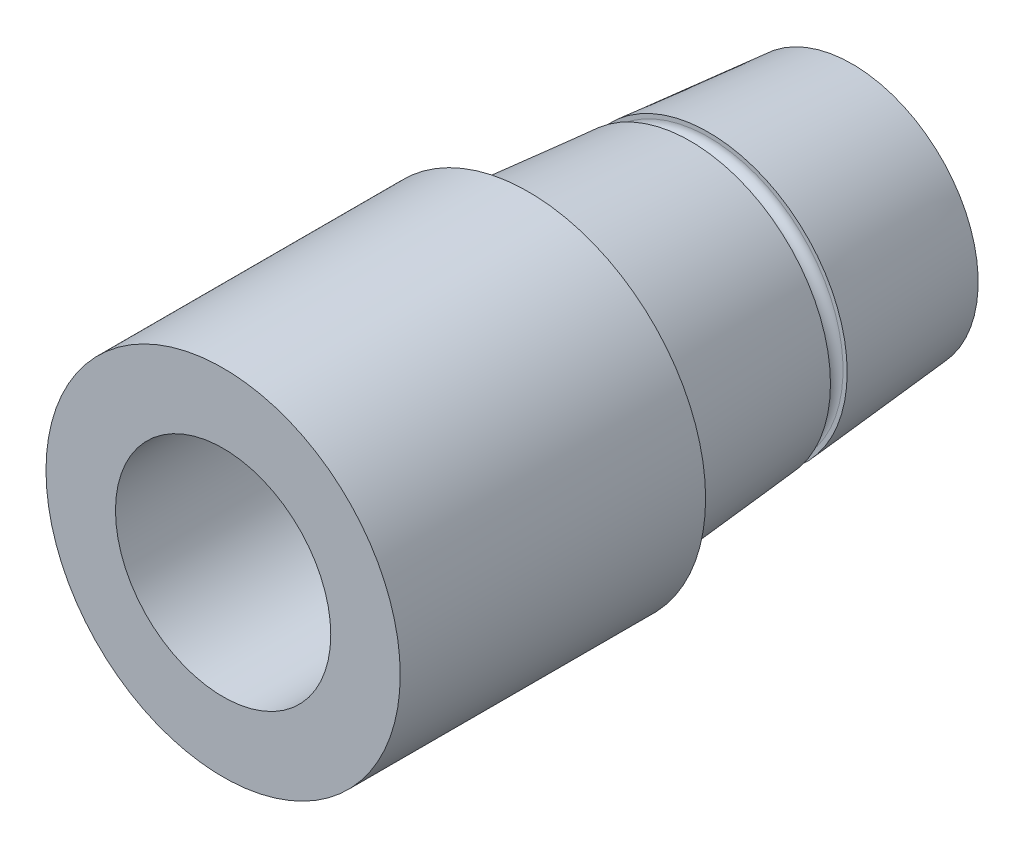
ISO-10303-21;
HEADER;
FILE_DESCRIPTION(('STEP AP214'),'2;1');
FILE_NAME('part.step','',(''),(''),'','','');
FILE_SCHEMA(('AUTOMOTIVE_DESIGN { 1 0 10303 214 1 1 1 1 }'));
ENDSEC;
DATA;
#1=APPLICATION_CONTEXT('core data for automotive mechanical design processes');
#2=APPLICATION_PROTOCOL_DEFINITION('international standard','automotive_design',2000,#1);
#3=PRODUCT_CONTEXT('',#1,'mechanical');
#4=PRODUCT('Part','Part','',(#3));
#5=PRODUCT_RELATED_PRODUCT_CATEGORY('part','',(#4));
#6=PRODUCT_DEFINITION_FORMATION('','',#4);
#7=PRODUCT_DEFINITION_CONTEXT('part definition',#1,'design');
#8=PRODUCT_DEFINITION('design','',#6,#7);
#9=PRODUCT_DEFINITION_SHAPE('','',#8);
#10=(LENGTH_UNIT() NAMED_UNIT(*) SI_UNIT(.MILLI.,.METRE.));
#11=(NAMED_UNIT(*) PLANE_ANGLE_UNIT() SI_UNIT($,.RADIAN.));
#12=(NAMED_UNIT(*) SI_UNIT($,.STERADIAN.) SOLID_ANGLE_UNIT());
#13=UNCERTAINTY_MEASURE_WITH_UNIT(LENGTH_MEASURE(1.E-05),#10,'distance_accuracy_value','');
#14=(GEOMETRIC_REPRESENTATION_CONTEXT(3) GLOBAL_UNCERTAINTY_ASSIGNED_CONTEXT((#13)) GLOBAL_UNIT_ASSIGNED_CONTEXT((#10,
#11,#12)) REPRESENTATION_CONTEXT('',''));
#15=CARTESIAN_POINT('',(0.,0.,0.));
#16=DIRECTION('',(0.,0.,1.));
#17=DIRECTION('',(1.,0.,0.));
#18=AXIS2_PLACEMENT_3D('',#15,#16,#17);
#19=CARTESIAN_POINT('',(0.,0.,-50.));
#20=DIRECTION('',(0.,0.,1.));
#21=DIRECTION('',(-1.,0.,0.));
#22=AXIS2_PLACEMENT_3D('',#19,#20,#21);
#23=CONICAL_SURFACE('',#22,20.6255668237038,0.0872664625997167);
#24=CARTESIAN_POINT('',(0.,0.,-26.5));
#25=DIRECTION('',(0.,0.,-1.));
#26=DIRECTION('',(-1.,0.,0.));
#27=AXIS2_PLACEMENT_3D('',#24,#25,#26);
#28=CIRCLE('',#27,22.681550416563);
#29=CARTESIAN_POINT('',(-22.681550416563,0.,-26.5));
#30=VERTEX_POINT('',#29);
#31=EDGE_CURVE('E35',#30,#30,#28,.F.);
#32=ORIENTED_EDGE('',*,*,#31,.F.);
#33=EDGE_LOOP('',(#32));
#34=FACE_BOUND('',#33,.T.);
#35=CARTESIAN_POINT('',(0.,0.,-50.));
#36=DIRECTION('',(0.,0.,-1.));
#37=DIRECTION('',(-1.,0.,0.));
#38=AXIS2_PLACEMENT_3D('',#35,#36,#37);
#39=CIRCLE('',#38,20.6255668237038);
#40=CARTESIAN_POINT('',(-20.6255668237038,0.,-50.));
#41=VERTEX_POINT('',#40);
#42=EDGE_CURVE('E10',#41,#41,#39,.T.);
#43=ORIENTED_EDGE('',*,*,#42,.F.);
#44=EDGE_LOOP('',(#43));
#45=FACE_BOUND('',#44,.T.);
#46=ADVANCED_FACE('F31',(#34,#45),#23,.T.);
#47=CARTESIAN_POINT('',(0.,0.,-23.5));
#48=DIRECTION('',(0.,0.,1.));
#49=DIRECTION('',(1.,0.,0.));
#50=AXIS2_PLACEMENT_3D('',#47,#48,#49);
#51=CIRCLE('',#50,22.9440164071408);
#52=CARTESIAN_POINT('',(22.9440164071408,0.,-23.5));
#53=VERTEX_POINT('',#52);
#54=EDGE_CURVE('E51',#53,#53,#51,.F.);
#55=ORIENTED_EDGE('',*,*,#54,.F.);
#56=EDGE_LOOP('',(#55));
#57=FACE_BOUND('',#56,.T.);
#58=CARTESIAN_POINT('',(0.,0.,3.));
#59=DIRECTION('',(0.,0.,-1.));
#60=DIRECTION('',(-1.,0.,0.));
#61=AXIS2_PLACEMENT_3D('',#58,#59,#60);
#62=CIRCLE('',#61,25.2624659905778);
#63=CARTESIAN_POINT('',(-25.2624659905778,0.,3.));
#64=VERTEX_POINT('',#63);
#65=EDGE_CURVE('E47',#64,#64,#62,.T.);
#66=ORIENTED_EDGE('',*,*,#65,.T.);
#67=EDGE_LOOP('',(#66));
#68=FACE_BOUND('',#67,.T.);
#69=ADVANCED_FACE('F33',(#57,#68),#23,.T.);
#70=CARTESIAN_POINT('',(0.,0.,-50.));
#71=DIRECTION('',(0.,0.,-1.));
#72=DIRECTION('',(-1.,0.,0.));
#73=AXIS2_PLACEMENT_3D('',#70,#71,#72);
#74=PLANE('',#73);
#75=CARTESIAN_POINT('',(0.,0.,-50.));
#76=DIRECTION('',(0.,0.,-1.));
#77=DIRECTION('',(-1.,0.,0.));
#78=AXIS2_PLACEMENT_3D('',#75,#76,#77);
#79=CIRCLE('',#78,17.6255668237038);
#80=CARTESIAN_POINT('',(-17.6255668237038,0.,-50.));
#81=VERTEX_POINT('',#80);
#82=EDGE_CURVE('E39',#81,#81,#79,.T.);
#83=ORIENTED_EDGE('',*,*,#82,.F.);
#84=EDGE_LOOP('',(#83));
#85=FACE_BOUND('',#84,.T.);
#86=ORIENTED_EDGE('',*,*,#42,.T.);
#87=EDGE_LOOP('',(#86));
#88=FACE_BOUND('',#87,.T.);
#89=ADVANCED_FACE('F94',(#85,#88),#74,.T.);
#90=CARTESIAN_POINT('',(0.,0.,3.));
#91=DIRECTION('',(0.,0.,-1.));
#92=DIRECTION('',(-1.,0.,0.));
#93=AXIS2_PLACEMENT_3D('',#90,#91,#92);
#94=CYLINDRICAL_SURFACE('',#93,17.6255668237038);
#95=ORIENTED_EDGE('',*,*,#82,.T.);
#96=EDGE_LOOP('',(#95));
#97=FACE_BOUND('',#96,.T.);
#98=CARTESIAN_POINT('',(0.,0.,53.));
#99=DIRECTION('',(0.,0.,1.));
#100=DIRECTION('',(1.,0.,0.));
#101=AXIS2_PLACEMENT_3D('',#98,#99,#100);
#102=CIRCLE('',#101,17.6255668237038);
#103=CARTESIAN_POINT('',(17.6255668237038,0.,53.));
#104=VERTEX_POINT('',#103);
#105=EDGE_CURVE('E66',#104,#104,#102,.T.);
#106=ORIENTED_EDGE('',*,*,#105,.T.);
#107=EDGE_LOOP('',(#106));
#108=FACE_BOUND('',#107,.T.);
#109=ADVANCED_FACE('F72',(#97,#108),#94,.F.);
#110=CARTESIAN_POINT('',(0.,0.,-25.));
#111=DIRECTION('',(0.,0.,-1.));
#112=DIRECTION('',(-1.,0.,0.));
#113=AXIS2_PLACEMENT_3D('',#110,#111,#112);
#114=TOROIDAL_SURFACE('',#113,22.,1.5);
#115=CARTESIAN_POINT('',(0.,0.,-26.5));
#116=DIRECTION('',(0.,0.,-1.));
#117=DIRECTION('',(-1.,0.,0.));
#118=AXIS2_PLACEMENT_3D('',#115,#116,#117);
#119=CIRCLE('',#118,22.);
#120=CARTESIAN_POINT('',(-22.,0.,-26.5));
#121=VERTEX_POINT('',#120);
#122=EDGE_CURVE('E53',#121,#121,#119,.T.);
#123=ORIENTED_EDGE('',*,*,#122,.F.);
#124=EDGE_LOOP('',(#123));
#125=FACE_BOUND('',#124,.T.);
#126=CARTESIAN_POINT('',(0.,0.,-23.5));
#127=DIRECTION('',(0.,0.,-1.));
#128=DIRECTION('',(-1.,0.,0.));
#129=AXIS2_PLACEMENT_3D('',#126,#127,#128);
#130=CIRCLE('',#129,22.);
#131=CARTESIAN_POINT('',(-22.,0.,-23.5));
#132=VERTEX_POINT('',#131);
#133=EDGE_CURVE('E49',#132,#132,#130,.T.);
#134=ORIENTED_EDGE('',*,*,#133,.T.);
#135=EDGE_LOOP('',(#134));
#136=FACE_BOUND('',#135,.T.);
#137=ADVANCED_FACE('F100',(#125,#136),#114,.F.);
#138=CARTESIAN_POINT('',(0.,22.,-26.5));
#139=DIRECTION('',(0.,0.,-1.));
#140=DIRECTION('',(-1.,0.,0.));
#141=AXIS2_PLACEMENT_3D('',#138,#139,#140);
#142=PLANE('',#141);
#143=ORIENTED_EDGE('',*,*,#31,.T.);
#144=EDGE_LOOP('',(#143));
#145=FACE_BOUND('',#144,.T.);
#146=ORIENTED_EDGE('',*,*,#122,.T.);
#147=EDGE_LOOP('',(#146));
#148=FACE_BOUND('',#147,.T.);
#149=ADVANCED_FACE('F87',(#145,#148),#142,.F.);
#150=CARTESIAN_POINT('',(0.,23.5,-23.5));
#151=DIRECTION('',(0.,0.,1.));
#152=DIRECTION('',(1.,0.,0.));
#153=AXIS2_PLACEMENT_3D('',#150,#151,#152);
#154=PLANE('',#153);
#155=ORIENTED_EDGE('',*,*,#54,.T.);
#156=EDGE_LOOP('',(#155));
#157=FACE_BOUND('',#156,.T.);
#158=ORIENTED_EDGE('',*,*,#133,.F.);
#159=EDGE_LOOP('',(#158));
#160=FACE_BOUND('',#159,.T.);
#161=ADVANCED_FACE('F77',(#157,#160),#154,.F.);
#162=CARTESIAN_POINT('',(0.,0.,53.));
#163=DIRECTION('',(0.,0.,1.));
#164=DIRECTION('',(1.,0.,0.));
#165=AXIS2_PLACEMENT_3D('',#162,#163,#164);
#166=PLANE('',#165);
#167=CARTESIAN_POINT('',(0.,0.,53.));
#168=DIRECTION('',(0.,0.,1.));
#169=DIRECTION('',(1.,0.,0.));
#170=AXIS2_PLACEMENT_3D('',#167,#168,#169);
#171=CIRCLE('',#170,29.);
#172=CARTESIAN_POINT('',(29.,0.,53.));
#173=VERTEX_POINT('',#172);
#174=EDGE_CURVE('E50',#173,#173,#171,.T.);
#175=ORIENTED_EDGE('',*,*,#174,.T.);
#176=EDGE_LOOP('',(#175));
#177=FACE_BOUND('',#176,.T.);
#178=ORIENTED_EDGE('',*,*,#105,.F.);
#179=EDGE_LOOP('',(#178));
#180=FACE_BOUND('',#179,.T.);
#181=ADVANCED_FACE('F74',(#177,#180),#166,.T.);
#182=CARTESIAN_POINT('',(0.,0.,3.));
#183=DIRECTION('',(0.,0.,1.));
#184=DIRECTION('',(1.,0.,0.));
#185=AXIS2_PLACEMENT_3D('',#182,#183,#184);
#186=PLANE('',#185);
#187=ORIENTED_EDGE('',*,*,#65,.F.);
#188=EDGE_LOOP('',(#187));
#189=FACE_BOUND('',#188,.T.);
#190=CARTESIAN_POINT('',(0.,0.,3.));
#191=DIRECTION('',(0.,0.,1.));
#192=DIRECTION('',(1.,0.,0.));
#193=AXIS2_PLACEMENT_3D('',#190,#191,#192);
#194=CIRCLE('',#193,29.);
#195=CARTESIAN_POINT('',(29.,0.,3.));
#196=VERTEX_POINT('',#195);
#197=EDGE_CURVE('E63',#196,#196,#194,.T.);
#198=ORIENTED_EDGE('',*,*,#197,.F.);
#199=EDGE_LOOP('',(#198));
#200=FACE_BOUND('',#199,.T.);
#201=ADVANCED_FACE('F76',(#189,#200),#186,.F.);
#202=CARTESIAN_POINT('',(0.,0.,53.));
#203=DIRECTION('',(0.,0.,-1.));
#204=DIRECTION('',(-1.,0.,0.));
#205=AXIS2_PLACEMENT_3D('',#202,#203,#204);
#206=CYLINDRICAL_SURFACE('',#205,29.);
#207=ORIENTED_EDGE('',*,*,#174,.F.);
#208=EDGE_LOOP('',(#207));
#209=FACE_BOUND('',#208,.T.);
#210=ORIENTED_EDGE('',*,*,#197,.T.);
#211=EDGE_LOOP('',(#210));
#212=FACE_BOUND('',#211,.T.);
#213=ADVANCED_FACE('F84',(#209,#212),#206,.T.);
#214=CLOSED_SHELL('',(#46,#69,#89,#109,#137,#149,#161,#181,#201,#213));
#215=MANIFOLD_SOLID_BREP('B2',#214);
#216=ADVANCED_BREP_SHAPE_REPRESENTATION('',(#18,#215),#14);
#217=SHAPE_DEFINITION_REPRESENTATION(#9,#216);
ENDSEC;
END-ISO-10303-21;
